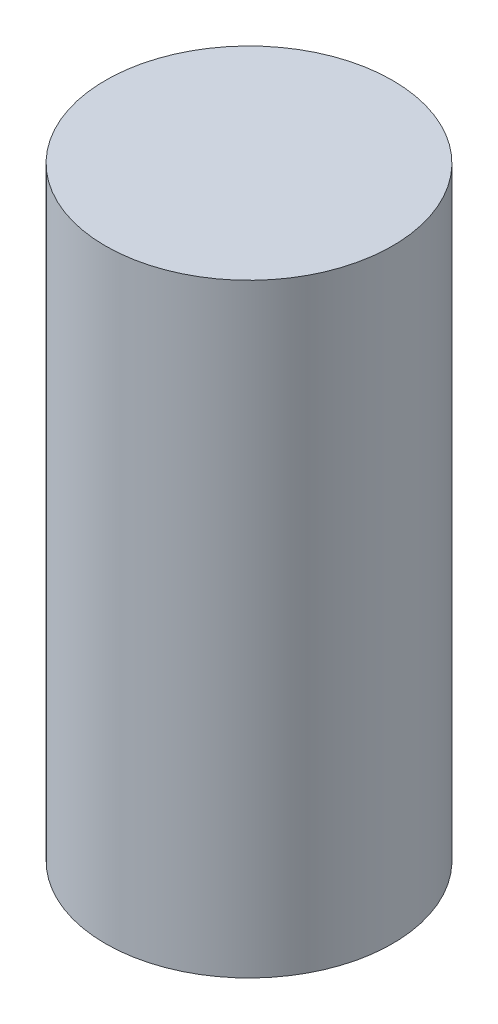
ISO-10303-21;
HEADER;
FILE_DESCRIPTION(('STEP AP214'),'2;1');
FILE_NAME('part.step','',(''),(''),'','','');
FILE_SCHEMA(('AUTOMOTIVE_DESIGN { 1 0 10303 214 1 1 1 1 }'));
ENDSEC;
DATA;
#1=APPLICATION_CONTEXT('core data for automotive mechanical design processes');
#2=APPLICATION_PROTOCOL_DEFINITION('international standard','automotive_design',2000,#1);
#3=PRODUCT_CONTEXT('',#1,'mechanical');
#4=PRODUCT('Part','Part','',(#3));
#5=PRODUCT_RELATED_PRODUCT_CATEGORY('part','',(#4));
#6=PRODUCT_DEFINITION_FORMATION('','',#4);
#7=PRODUCT_DEFINITION_CONTEXT('part definition',#1,'design');
#8=PRODUCT_DEFINITION('design','',#6,#7);
#9=PRODUCT_DEFINITION_SHAPE('','',#8);
#10=(LENGTH_UNIT() NAMED_UNIT(*) SI_UNIT(.MILLI.,.METRE.));
#11=(NAMED_UNIT(*) PLANE_ANGLE_UNIT() SI_UNIT($,.RADIAN.));
#12=(NAMED_UNIT(*) SI_UNIT($,.STERADIAN.) SOLID_ANGLE_UNIT());
#13=UNCERTAINTY_MEASURE_WITH_UNIT(LENGTH_MEASURE(1.E-05),#10,'distance_accuracy_value','');
#14=(GEOMETRIC_REPRESENTATION_CONTEXT(3) GLOBAL_UNCERTAINTY_ASSIGNED_CONTEXT((#13)) GLOBAL_UNIT_ASSIGNED_CONTEXT((#10,
#11,#12)) REPRESENTATION_CONTEXT('',''));
#15=CARTESIAN_POINT('',(0.,0.,0.));
#16=DIRECTION('',(0.,0.,1.));
#17=DIRECTION('',(1.,0.,0.));
#18=AXIS2_PLACEMENT_3D('',#15,#16,#17);
#19=CARTESIAN_POINT('',(0.,400.,0.));
#20=DIRECTION('',(0.,-1.,0.));
#21=DIRECTION('',(0.,0.,-1.));
#22=AXIS2_PLACEMENT_3D('',#19,#20,#21);
#23=CYLINDRICAL_SURFACE('',#22,95.);
#24=CARTESIAN_POINT('',(0.,400.,0.));
#25=DIRECTION('',(0.,1.,0.));
#26=DIRECTION('',(0.,0.,1.));
#27=AXIS2_PLACEMENT_3D('',#24,#25,#26);
#28=CIRCLE('',#27,95.);
#29=CARTESIAN_POINT('',(0.,400.,95.));
#30=VERTEX_POINT('',#29);
#31=EDGE_CURVE('E10',#30,#30,#28,.T.);
#32=ORIENTED_EDGE('',*,*,#31,.F.);
#33=EDGE_LOOP('',(#32));
#34=FACE_BOUND('',#33,.T.);
#35=CARTESIAN_POINT('',(0.,0.,0.));
#36=DIRECTION('',(0.,1.,0.));
#37=DIRECTION('',(0.,0.,1.));
#38=AXIS2_PLACEMENT_3D('',#35,#36,#37);
#39=CIRCLE('',#38,95.);
#40=CARTESIAN_POINT('',(0.,0.,95.));
#41=VERTEX_POINT('',#40);
#42=EDGE_CURVE('E34',#41,#41,#39,.T.);
#43=ORIENTED_EDGE('',*,*,#42,.T.);
#44=EDGE_LOOP('',(#43));
#45=FACE_BOUND('',#44,.T.);
#46=ADVANCED_FACE('F31',(#34,#45),#23,.T.);
#47=CARTESIAN_POINT('',(0.,400.,0.));
#48=DIRECTION('',(0.,1.,0.));
#49=DIRECTION('',(0.,0.,1.));
#50=AXIS2_PLACEMENT_3D('',#47,#48,#49);
#51=PLANE('',#50);
#52=ORIENTED_EDGE('',*,*,#31,.T.);
#53=EDGE_LOOP('',(#52));
#54=FACE_BOUND('',#53,.T.);
#55=ADVANCED_FACE('F46',(#54),#51,.T.);
#56=CARTESIAN_POINT('',(0.,0.,0.));
#57=DIRECTION('',(0.,1.,0.));
#58=DIRECTION('',(0.,0.,1.));
#59=AXIS2_PLACEMENT_3D('',#56,#57,#58);
#60=PLANE('',#59);
#61=ORIENTED_EDGE('',*,*,#42,.F.);
#62=EDGE_LOOP('',(#61));
#63=FACE_BOUND('',#62,.T.);
#64=ADVANCED_FACE('F44',(#63),#60,.F.);
#65=CLOSED_SHELL('',(#46,#55,#64));
#66=MANIFOLD_SOLID_BREP('B2',#65);
#67=ADVANCED_BREP_SHAPE_REPRESENTATION('',(#18,#66),#14);
#68=SHAPE_DEFINITION_REPRESENTATION(#9,#67);
ENDSEC;
END-ISO-10303-21;
